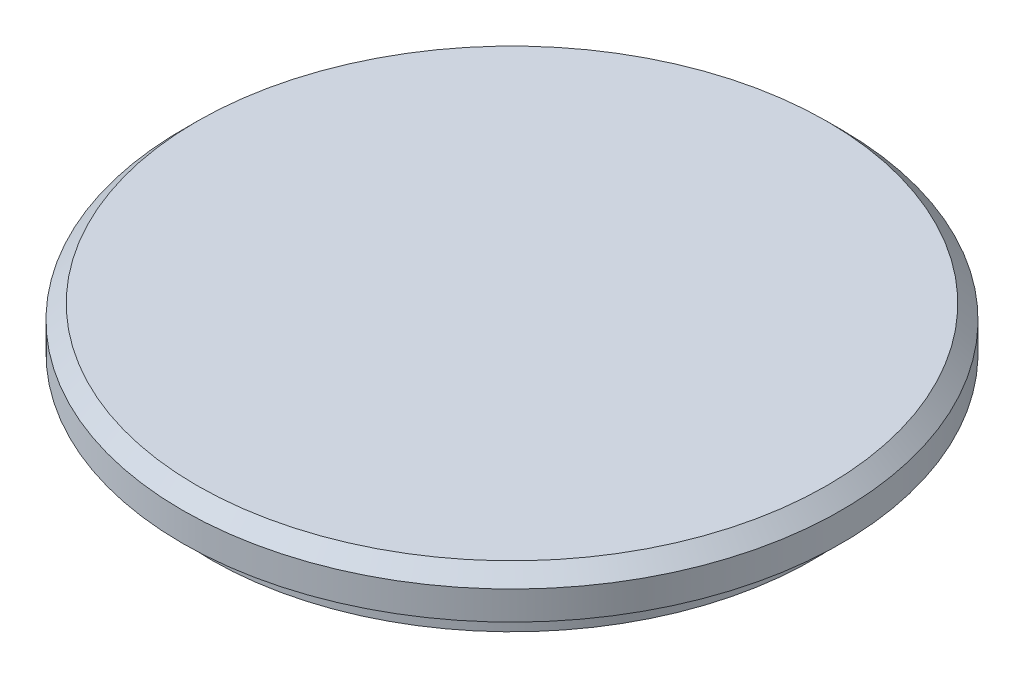
ISO-10303-21;
HEADER;
FILE_DESCRIPTION(('STEP AP214'),'2;1');
FILE_NAME('part.step','',(''),(''),'','','');
FILE_SCHEMA(('AUTOMOTIVE_DESIGN { 1 0 10303 214 1 1 1 1 }'));
ENDSEC;
DATA;
#1=APPLICATION_CONTEXT('core data for automotive mechanical design processes');
#2=APPLICATION_PROTOCOL_DEFINITION('international standard','automotive_design',2000,#1);
#3=PRODUCT_CONTEXT('',#1,'mechanical');
#4=PRODUCT('Part','Part','',(#3));
#5=PRODUCT_RELATED_PRODUCT_CATEGORY('part','',(#4));
#6=PRODUCT_DEFINITION_FORMATION('','',#4);
#7=PRODUCT_DEFINITION_CONTEXT('part definition',#1,'design');
#8=PRODUCT_DEFINITION('design','',#6,#7);
#9=PRODUCT_DEFINITION_SHAPE('','',#8);
#10=(LENGTH_UNIT() NAMED_UNIT(*) SI_UNIT(.MILLI.,.METRE.));
#11=(NAMED_UNIT(*) PLANE_ANGLE_UNIT() SI_UNIT($,.RADIAN.));
#12=(NAMED_UNIT(*) SI_UNIT($,.STERADIAN.) SOLID_ANGLE_UNIT());
#13=UNCERTAINTY_MEASURE_WITH_UNIT(LENGTH_MEASURE(1.E-05),#10,'distance_accuracy_value','');
#14=(GEOMETRIC_REPRESENTATION_CONTEXT(3) GLOBAL_UNCERTAINTY_ASSIGNED_CONTEXT((#13)) GLOBAL_UNIT_ASSIGNED_CONTEXT((#10,
#11,#12)) REPRESENTATION_CONTEXT('',''));
#15=CARTESIAN_POINT('',(0.,0.,0.));
#16=DIRECTION('',(0.,0.,1.));
#17=DIRECTION('',(1.,0.,0.));
#18=AXIS2_PLACEMENT_3D('',#15,#16,#17);
#19=CARTESIAN_POINT('',(18.5,10.,0.));
#20=DIRECTION('',(0.,1.,0.));
#21=DIRECTION('',(0.,0.,1.));
#22=AXIS2_PLACEMENT_3D('',#19,#20,#21);
#23=PLANE('',#22);
#24=CARTESIAN_POINT('',(0.,10.,0.));
#25=DIRECTION('',(0.,1.,0.));
#26=DIRECTION('',(0.,0.,1.));
#27=AXIS2_PLACEMENT_3D('',#24,#25,#26);
#28=CIRCLE('',#27,18.5);
#29=CARTESIAN_POINT('',(0.,10.,18.5));
#30=VERTEX_POINT('',#29);
#31=EDGE_CURVE('E10',#30,#30,#28,.T.);
#32=ORIENTED_EDGE('',*,*,#31,.F.);
#33=EDGE_LOOP('',(#32));
#34=FACE_BOUND('',#33,.T.);
#35=ADVANCED_FACE('F27',(#34),#23,.F.);
#36=CARTESIAN_POINT('',(0.,9.50000000000001,0.));
#37=DIRECTION('',(0.,1.,0.));
#38=DIRECTION('',(0.,0.,1.));
#39=AXIS2_PLACEMENT_3D('',#36,#37,#38);
#40=TOROIDAL_SURFACE('',#39,18.5,0.5);
#41=CARTESIAN_POINT('',(0.,9.5,0.));
#42=DIRECTION('',(0.,1.,0.));
#43=DIRECTION('',(0.,0.,1.));
#44=AXIS2_PLACEMENT_3D('',#41,#42,#43);
#45=CIRCLE('',#44,19.);
#46=CARTESIAN_POINT('',(0.,9.5,19.));
#47=VERTEX_POINT('',#46);
#48=EDGE_CURVE('E33',#47,#47,#45,.T.);
#49=ORIENTED_EDGE('',*,*,#48,.F.);
#50=EDGE_LOOP('',(#49));
#51=FACE_BOUND('',#50,.T.);
#52=ORIENTED_EDGE('',*,*,#31,.T.);
#53=EDGE_LOOP('',(#52));
#54=FACE_BOUND('',#53,.T.);
#55=ADVANCED_FACE('F93',(#51,#54),#40,.F.);
#56=CARTESIAN_POINT('',(0.,60.,0.));
#57=DIRECTION('',(0.,1.,0.));
#58=DIRECTION('',(0.,0.,1.));
#59=AXIS2_PLACEMENT_3D('',#56,#57,#58);
#60=CYLINDRICAL_SURFACE('',#59,19.);
#61=CARTESIAN_POINT('',(0.,7.00000000000001,0.));
#62=DIRECTION('',(0.,1.,0.));
#63=DIRECTION('',(0.,0.,1.));
#64=AXIS2_PLACEMENT_3D('',#61,#62,#63);
#65=CIRCLE('',#64,19.);
#66=CARTESIAN_POINT('',(0.,7.00000000000001,19.));
#67=VERTEX_POINT('',#66);
#68=EDGE_CURVE('E37',#67,#67,#65,.T.);
#69=ORIENTED_EDGE('',*,*,#68,.F.);
#70=EDGE_LOOP('',(#69));
#71=FACE_BOUND('',#70,.T.);
#72=ORIENTED_EDGE('',*,*,#48,.T.);
#73=EDGE_LOOP('',(#72));
#74=FACE_BOUND('',#73,.T.);
#75=ADVANCED_FACE('F88',(#71,#74),#60,.F.);
#76=CARTESIAN_POINT('',(21.,7.00000000000001,0.));
#77=DIRECTION('',(0.,1.,0.));
#78=DIRECTION('',(0.,0.,1.));
#79=AXIS2_PLACEMENT_3D('',#76,#77,#78);
#80=PLANE('',#79);
#81=CARTESIAN_POINT('',(0.,7.00000000000001,0.));
#82=DIRECTION('',(0.,1.,0.));
#83=DIRECTION('',(0.,0.,1.));
#84=AXIS2_PLACEMENT_3D('',#81,#82,#83);
#85=CIRCLE('',#84,21.);
#86=CARTESIAN_POINT('',(0.,7.00000000000001,21.));
#87=VERTEX_POINT('',#86);
#88=EDGE_CURVE('E41',#87,#87,#85,.T.);
#89=ORIENTED_EDGE('',*,*,#88,.F.);
#90=EDGE_LOOP('',(#89));
#91=FACE_BOUND('',#90,.T.);
#92=ORIENTED_EDGE('',*,*,#68,.T.);
#93=EDGE_LOOP('',(#92));
#94=FACE_BOUND('',#93,.T.);
#95=ADVANCED_FACE('F82',(#91,#94),#80,.F.);
#96=CARTESIAN_POINT('',(0.,60.,0.));
#97=DIRECTION('',(0.,1.,0.));
#98=DIRECTION('',(0.,0.,1.));
#99=AXIS2_PLACEMENT_3D('',#96,#97,#98);
#100=CYLINDRICAL_SURFACE('',#99,21.);
#101=CARTESIAN_POINT('',(0.,9.00000000000001,0.));
#102=DIRECTION('',(0.,1.,0.));
#103=DIRECTION('',(0.,0.,1.));
#104=AXIS2_PLACEMENT_3D('',#101,#102,#103);
#105=CIRCLE('',#104,21.);
#106=CARTESIAN_POINT('',(0.,9.00000000000001,21.));
#107=VERTEX_POINT('',#106);
#108=EDGE_CURVE('E46',#107,#107,#105,.T.);
#109=ORIENTED_EDGE('',*,*,#108,.F.);
#110=EDGE_LOOP('',(#109));
#111=FACE_BOUND('',#110,.T.);
#112=ORIENTED_EDGE('',*,*,#88,.T.);
#113=EDGE_LOOP('',(#112));
#114=FACE_BOUND('',#113,.T.);
#115=ADVANCED_FACE('F76',(#111,#114),#100,.T.);
#116=CARTESIAN_POINT('',(23.,9.00000000000001,0.));
#117=DIRECTION('',(0.,1.,0.));
#118=DIRECTION('',(0.,0.,1.));
#119=AXIS2_PLACEMENT_3D('',#116,#117,#118);
#120=PLANE('',#119);
#121=CARTESIAN_POINT('',(0.,9.00000000000001,0.));
#122=DIRECTION('',(0.,1.,0.));
#123=DIRECTION('',(0.,0.,1.));
#124=AXIS2_PLACEMENT_3D('',#121,#122,#123);
#125=CIRCLE('',#124,23.);
#126=CARTESIAN_POINT('',(0.,9.00000000000001,23.));
#127=VERTEX_POINT('',#126);
#128=EDGE_CURVE('E49',#127,#127,#125,.T.);
#129=ORIENTED_EDGE('',*,*,#128,.F.);
#130=EDGE_LOOP('',(#129));
#131=FACE_BOUND('',#130,.T.);
#132=ORIENTED_EDGE('',*,*,#108,.T.);
#133=EDGE_LOOP('',(#132));
#134=FACE_BOUND('',#133,.T.);
#135=ADVANCED_FACE('F70',(#131,#134),#120,.F.);
#136=CARTESIAN_POINT('',(0.,60.,0.));
#137=DIRECTION('',(0.,1.,0.));
#138=DIRECTION('',(0.,0.,1.));
#139=AXIS2_PLACEMENT_3D('',#136,#137,#138);
#140=CYLINDRICAL_SURFACE('',#139,23.);
#141=CARTESIAN_POINT('',(0.,11.,0.));
#142=DIRECTION('',(0.,1.,0.));
#143=DIRECTION('',(0.,0.,1.));
#144=AXIS2_PLACEMENT_3D('',#141,#142,#143);
#145=CIRCLE('',#144,23.);
#146=CARTESIAN_POINT('',(0.,11.,23.));
#147=VERTEX_POINT('',#146);
#148=EDGE_CURVE('E52',#147,#147,#145,.T.);
#149=ORIENTED_EDGE('',*,*,#148,.F.);
#150=EDGE_LOOP('',(#149));
#151=FACE_BOUND('',#150,.T.);
#152=ORIENTED_EDGE('',*,*,#128,.T.);
#153=EDGE_LOOP('',(#152));
#154=FACE_BOUND('',#153,.T.);
#155=ADVANCED_FACE('F64',(#151,#154),#140,.T.);
#156=CARTESIAN_POINT('',(0.,11.,0.));
#157=DIRECTION('',(0.,-1.,0.));
#158=DIRECTION('',(0.,0.,-1.));
#159=AXIS2_PLACEMENT_3D('',#156,#157,#158);
#160=CONICAL_SURFACE('',#159,23.,0.785398163397448);
#161=CARTESIAN_POINT('',(0.,12.,0.));
#162=DIRECTION('',(0.,1.,0.));
#163=DIRECTION('',(0.,0.,1.));
#164=AXIS2_PLACEMENT_3D('',#161,#162,#163);
#165=CIRCLE('',#164,22.);
#166=CARTESIAN_POINT('',(0.,12.,22.));
#167=VERTEX_POINT('',#166);
#168=EDGE_CURVE('E55',#167,#167,#165,.T.);
#169=ORIENTED_EDGE('',*,*,#168,.F.);
#170=EDGE_LOOP('',(#169));
#171=FACE_BOUND('',#170,.T.);
#172=ORIENTED_EDGE('',*,*,#148,.T.);
#173=EDGE_LOOP('',(#172));
#174=FACE_BOUND('',#173,.T.);
#175=ADVANCED_FACE('F61',(#171,#174),#160,.T.);
#176=CARTESIAN_POINT('',(0.,12.,0.));
#177=DIRECTION('',(0.,-1.,0.));
#178=DIRECTION('',(0.,0.,-1.));
#179=AXIS2_PLACEMENT_3D('',#176,#177,#178);
#180=PLANE('',#179);
#181=ORIENTED_EDGE('',*,*,#168,.T.);
#182=EDGE_LOOP('',(#181));
#183=FACE_BOUND('',#182,.T.);
#184=ADVANCED_FACE('F59',(#183),#180,.F.);
#185=CLOSED_SHELL('',(#35,#55,#75,#95,#115,#135,#155,#175,#184));
#186=MANIFOLD_SOLID_BREP('B2',#185);
#187=ADVANCED_BREP_SHAPE_REPRESENTATION('',(#18,#186),#14);
#188=SHAPE_DEFINITION_REPRESENTATION(#9,#187);
ENDSEC;
END-ISO-10303-21;
